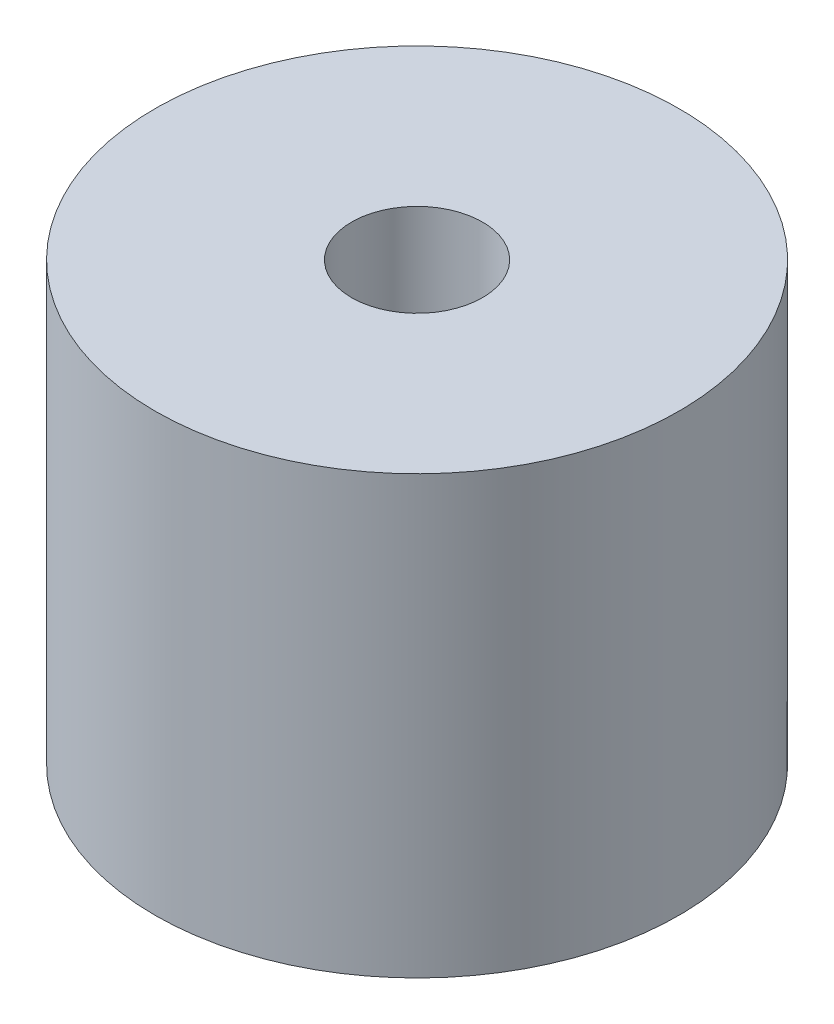
ISO-10303-21;
HEADER;
FILE_DESCRIPTION(('STEP AP214'),'2;1');
FILE_NAME('part.step','',(''),(''),'','','');
FILE_SCHEMA(('AUTOMOTIVE_DESIGN { 1 0 10303 214 1 1 1 1 }'));
ENDSEC;
DATA;
#1=APPLICATION_CONTEXT('core data for automotive mechanical design processes');
#2=APPLICATION_PROTOCOL_DEFINITION('international standard','automotive_design',2000,#1);
#3=PRODUCT_CONTEXT('',#1,'mechanical');
#4=PRODUCT('Part','Part','',(#3));
#5=PRODUCT_RELATED_PRODUCT_CATEGORY('part','',(#4));
#6=PRODUCT_DEFINITION_FORMATION('','',#4);
#7=PRODUCT_DEFINITION_CONTEXT('part definition',#1,'design');
#8=PRODUCT_DEFINITION('design','',#6,#7);
#9=PRODUCT_DEFINITION_SHAPE('','',#8);
#10=(LENGTH_UNIT() NAMED_UNIT(*) SI_UNIT(.MILLI.,.METRE.));
#11=(NAMED_UNIT(*) PLANE_ANGLE_UNIT() SI_UNIT($,.RADIAN.));
#12=(NAMED_UNIT(*) SI_UNIT($,.STERADIAN.) SOLID_ANGLE_UNIT());
#13=UNCERTAINTY_MEASURE_WITH_UNIT(LENGTH_MEASURE(1.E-05),#10,'distance_accuracy_value','');
#14=(GEOMETRIC_REPRESENTATION_CONTEXT(3) GLOBAL_UNCERTAINTY_ASSIGNED_CONTEXT((#13)) GLOBAL_UNIT_ASSIGNED_CONTEXT((#10,
#11,#12)) REPRESENTATION_CONTEXT('',''));
#15=CARTESIAN_POINT('',(0.,0.,0.));
#16=DIRECTION('',(0.,0.,1.));
#17=DIRECTION('',(1.,0.,0.));
#18=AXIS2_PLACEMENT_3D('',#15,#16,#17);
#19=CARTESIAN_POINT('',(0.,5.,0.));
#20=DIRECTION('',(0.,-1.,0.));
#21=DIRECTION('',(0.,0.,-1.));
#22=AXIS2_PLACEMENT_3D('',#19,#20,#21);
#23=CYLINDRICAL_SURFACE('',#22,3.);
#24=CARTESIAN_POINT('',(0.,5.,0.));
#25=DIRECTION('',(0.,1.,0.));
#26=DIRECTION('',(0.,0.,1.));
#27=AXIS2_PLACEMENT_3D('',#24,#25,#26);
#28=CIRCLE('',#27,3.);
#29=CARTESIAN_POINT('',(0.,5.,3.));
#30=VERTEX_POINT('',#29);
#31=EDGE_CURVE('E10',#30,#30,#28,.T.);
#32=ORIENTED_EDGE('',*,*,#31,.F.);
#33=EDGE_LOOP('',(#32));
#34=FACE_BOUND('',#33,.T.);
#35=CARTESIAN_POINT('',(0.,0.,0.));
#36=DIRECTION('',(0.,1.,0.));
#37=DIRECTION('',(0.,0.,1.));
#38=AXIS2_PLACEMENT_3D('',#35,#36,#37);
#39=CIRCLE('',#38,3.);
#40=CARTESIAN_POINT('',(0.,0.,3.));
#41=VERTEX_POINT('',#40);
#42=EDGE_CURVE('E34',#41,#41,#39,.T.);
#43=ORIENTED_EDGE('',*,*,#42,.T.);
#44=EDGE_LOOP('',(#43));
#45=FACE_BOUND('',#44,.T.);
#46=ADVANCED_FACE('F31',(#34,#45),#23,.T.);
#47=CARTESIAN_POINT('',(0.,5.,0.));
#48=DIRECTION('',(0.,1.,0.));
#49=DIRECTION('',(0.,0.,1.));
#50=AXIS2_PLACEMENT_3D('',#47,#48,#49);
#51=PLANE('',#50);
#52=CARTESIAN_POINT('',(0.,5.,0.));
#53=DIRECTION('',(0.,1.,0.));
#54=DIRECTION('',(0.,0.,1.));
#55=AXIS2_PLACEMENT_3D('',#52,#53,#54);
#56=CIRCLE('',#55,0.75);
#57=CARTESIAN_POINT('',(0.,5.,0.75));
#58=VERTEX_POINT('',#57);
#59=EDGE_CURVE('E43',#58,#58,#56,.T.);
#60=ORIENTED_EDGE('',*,*,#59,.F.);
#61=EDGE_LOOP('',(#60));
#62=FACE_BOUND('',#61,.T.);
#63=ORIENTED_EDGE('',*,*,#31,.T.);
#64=EDGE_LOOP('',(#63));
#65=FACE_BOUND('',#64,.T.);
#66=ADVANCED_FACE('F58',(#62,#65),#51,.T.);
#67=CARTESIAN_POINT('',(0.,0.,0.));
#68=DIRECTION('',(0.,1.,0.));
#69=DIRECTION('',(0.,0.,1.));
#70=AXIS2_PLACEMENT_3D('',#67,#68,#69);
#71=PLANE('',#70);
#72=CARTESIAN_POINT('',(0.,0.,0.));
#73=DIRECTION('',(0.,1.,0.));
#74=DIRECTION('',(0.,0.,1.));
#75=AXIS2_PLACEMENT_3D('',#72,#73,#74);
#76=CIRCLE('',#75,0.75);
#77=CARTESIAN_POINT('',(0.,0.,0.75));
#78=VERTEX_POINT('',#77);
#79=EDGE_CURVE('E41',#78,#78,#76,.T.);
#80=ORIENTED_EDGE('',*,*,#79,.T.);
#81=EDGE_LOOP('',(#80));
#82=FACE_BOUND('',#81,.T.);
#83=ORIENTED_EDGE('',*,*,#42,.F.);
#84=EDGE_LOOP('',(#83));
#85=FACE_BOUND('',#84,.T.);
#86=ADVANCED_FACE('F49',(#82,#85),#71,.F.);
#87=CARTESIAN_POINT('',(0.,0.,0.));
#88=DIRECTION('',(0.,1.,0.));
#89=DIRECTION('',(0.,0.,1.));
#90=AXIS2_PLACEMENT_3D('',#87,#88,#89);
#91=CYLINDRICAL_SURFACE('',#90,0.75);
#92=ORIENTED_EDGE('',*,*,#79,.F.);
#93=EDGE_LOOP('',(#92));
#94=FACE_BOUND('',#93,.T.);
#95=ORIENTED_EDGE('',*,*,#59,.T.);
#96=EDGE_LOOP('',(#95));
#97=FACE_BOUND('',#96,.T.);
#98=ADVANCED_FACE('F52',(#94,#97),#91,.F.);
#99=CLOSED_SHELL('',(#46,#66,#86,#98));
#100=MANIFOLD_SOLID_BREP('B2',#99);
#101=ADVANCED_BREP_SHAPE_REPRESENTATION('',(#18,#100),#14);
#102=SHAPE_DEFINITION_REPRESENTATION(#9,#101);
ENDSEC;
END-ISO-10303-21;
